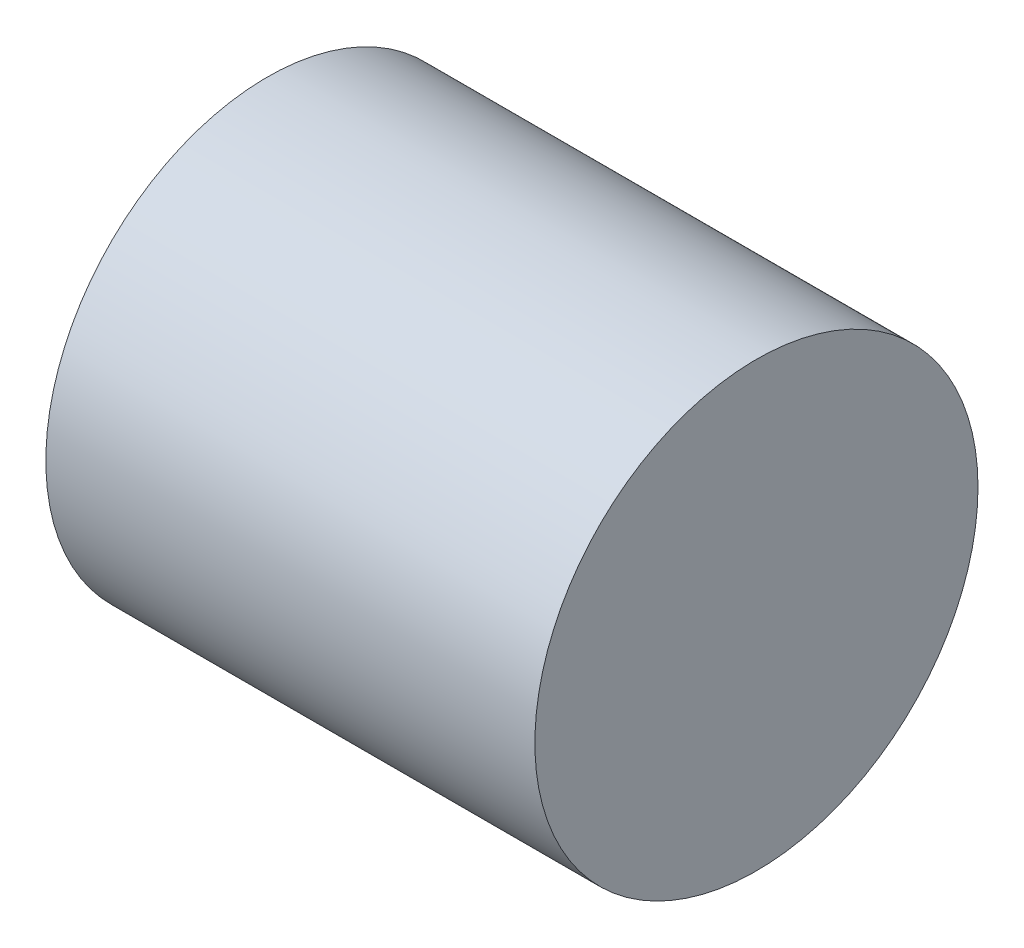
ISO-10303-21;
HEADER;
FILE_DESCRIPTION(('STEP AP214'),'2;1');
FILE_NAME('part.step','',(''),(''),'','','');
FILE_SCHEMA(('AUTOMOTIVE_DESIGN { 1 0 10303 214 1 1 1 1 }'));
ENDSEC;
DATA;
#1=APPLICATION_CONTEXT('core data for automotive mechanical design processes');
#2=APPLICATION_PROTOCOL_DEFINITION('international standard','automotive_design',2000,#1);
#3=PRODUCT_CONTEXT('',#1,'mechanical');
#4=PRODUCT('Part','Part','',(#3));
#5=PRODUCT_RELATED_PRODUCT_CATEGORY('part','',(#4));
#6=PRODUCT_DEFINITION_FORMATION('','',#4);
#7=PRODUCT_DEFINITION_CONTEXT('part definition',#1,'design');
#8=PRODUCT_DEFINITION('design','',#6,#7);
#9=PRODUCT_DEFINITION_SHAPE('','',#8);
#10=(LENGTH_UNIT() NAMED_UNIT(*) SI_UNIT(.MILLI.,.METRE.));
#11=(NAMED_UNIT(*) PLANE_ANGLE_UNIT() SI_UNIT($,.RADIAN.));
#12=(NAMED_UNIT(*) SI_UNIT($,.STERADIAN.) SOLID_ANGLE_UNIT());
#13=UNCERTAINTY_MEASURE_WITH_UNIT(LENGTH_MEASURE(1.E-05),#10,'distance_accuracy_value','');
#14=(GEOMETRIC_REPRESENTATION_CONTEXT(3) GLOBAL_UNCERTAINTY_ASSIGNED_CONTEXT((#13)) GLOBAL_UNIT_ASSIGNED_CONTEXT((#10,
#11,#12)) REPRESENTATION_CONTEXT('',''));
#15=CARTESIAN_POINT('',(0.,0.,0.));
#16=DIRECTION('',(0.,0.,1.));
#17=DIRECTION('',(1.,0.,0.));
#18=AXIS2_PLACEMENT_3D('',#15,#16,#17);
#19=CARTESIAN_POINT('',(-20.59193,-2.419,-9.173));
#20=DIRECTION('',(1.,0.,0.));
#21=DIRECTION('',(0.,0.,-1.));
#22=AXIS2_PLACEMENT_3D('',#19,#20,#21);
#23=CYLINDRICAL_SURFACE('',#22,9.32933);
#24=CARTESIAN_POINT('',(-20.59193,-2.419,-9.173));
#25=DIRECTION('',(1.,0.,0.));
#26=DIRECTION('',(0.,0.,-1.));
#27=AXIS2_PLACEMENT_3D('',#24,#25,#26);
#28=CIRCLE('',#27,9.32933);
#29=CARTESIAN_POINT('',(-20.59193,-2.419,-18.50233));
#30=VERTEX_POINT('',#29);
#31=EDGE_CURVE('E10',#30,#30,#28,.T.);
#32=ORIENTED_EDGE('',*,*,#31,.T.);
#33=EDGE_LOOP('',(#32));
#34=FACE_BOUND('',#33,.T.);
#35=CARTESIAN_POINT('',(0.,-2.419,-9.173));
#36=DIRECTION('',(1.,0.,0.));
#37=DIRECTION('',(0.,0.,-1.));
#38=AXIS2_PLACEMENT_3D('',#35,#36,#37);
#39=CIRCLE('',#38,9.32933);
#40=CARTESIAN_POINT('',(0.,-2.419,-18.50233));
#41=VERTEX_POINT('',#40);
#42=EDGE_CURVE('E45',#41,#41,#39,.T.);
#43=ORIENTED_EDGE('',*,*,#42,.F.);
#44=EDGE_LOOP('',(#43));
#45=FACE_BOUND('',#44,.T.);
#46=ADVANCED_FACE('F39',(#34,#45),#23,.T.);
#47=CARTESIAN_POINT('',(-20.59193,-2.419,-9.173));
#48=DIRECTION('',(1.,0.,0.));
#49=DIRECTION('',(0.,0.,-1.));
#50=AXIS2_PLACEMENT_3D('',#47,#48,#49);
#51=PLANE('',#50);
#52=ORIENTED_EDGE('',*,*,#31,.F.);
#53=EDGE_LOOP('',(#52));
#54=FACE_BOUND('',#53,.T.);
#55=ADVANCED_FACE('F53',(#54),#51,.F.);
#56=CARTESIAN_POINT('',(0.,-2.419,-9.173));
#57=DIRECTION('',(1.,0.,0.));
#58=DIRECTION('',(0.,0.,-1.));
#59=AXIS2_PLACEMENT_3D('',#56,#57,#58);
#60=PLANE('',#59);
#61=ORIENTED_EDGE('',*,*,#42,.T.);
#62=EDGE_LOOP('',(#61));
#63=FACE_BOUND('',#62,.T.);
#64=ADVANCED_FACE('F51',(#63),#60,.T.);
#65=CLOSED_SHELL('',(#46,#55,#64));
#66=MANIFOLD_SOLID_BREP('B2',#65);
#67=ADVANCED_BREP_SHAPE_REPRESENTATION('',(#18,#66),#14);
#68=SHAPE_DEFINITION_REPRESENTATION(#9,#67);
ENDSEC;
END-ISO-10303-21;
